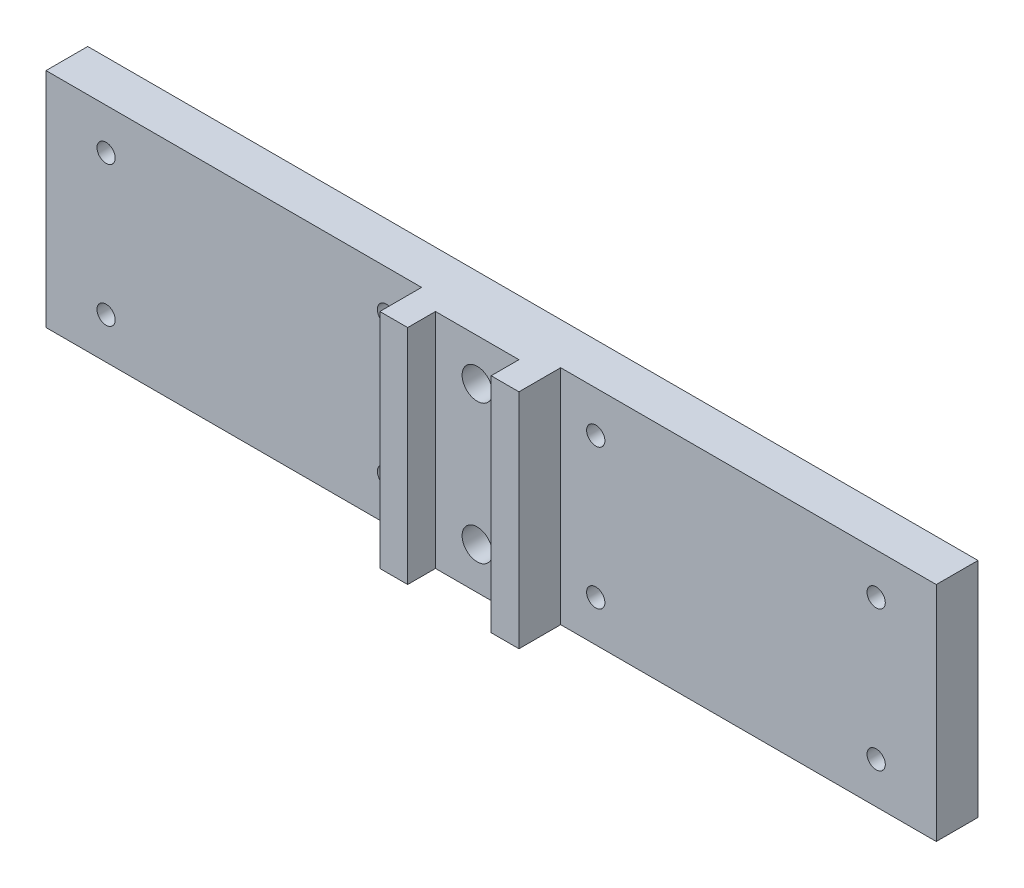
ISO-10303-21;
HEADER;
FILE_DESCRIPTION(('STEP AP214'),'2;1');
FILE_NAME('part.step','',(''),(''),'','','');
FILE_SCHEMA(('AUTOMOTIVE_DESIGN { 1 0 10303 214 1 1 1 1 }'));
ENDSEC;
DATA;
#1=APPLICATION_CONTEXT('core data for automotive mechanical design processes');
#2=APPLICATION_PROTOCOL_DEFINITION('international standard','automotive_design',2000,#1);
#3=PRODUCT_CONTEXT('',#1,'mechanical');
#4=PRODUCT('Part','Part','',(#3));
#5=PRODUCT_RELATED_PRODUCT_CATEGORY('part','',(#4));
#6=PRODUCT_DEFINITION_FORMATION('','',#4);
#7=PRODUCT_DEFINITION_CONTEXT('part definition',#1,'design');
#8=PRODUCT_DEFINITION('design','',#6,#7);
#9=PRODUCT_DEFINITION_SHAPE('','',#8);
#10=(LENGTH_UNIT() NAMED_UNIT(*) SI_UNIT(.MILLI.,.METRE.));
#11=(NAMED_UNIT(*) PLANE_ANGLE_UNIT() SI_UNIT($,.RADIAN.));
#12=(NAMED_UNIT(*) SI_UNIT($,.STERADIAN.) SOLID_ANGLE_UNIT());
#13=UNCERTAINTY_MEASURE_WITH_UNIT(LENGTH_MEASURE(1.E-05),#10,'distance_accuracy_value','');
#14=(GEOMETRIC_REPRESENTATION_CONTEXT(3) GLOBAL_UNCERTAINTY_ASSIGNED_CONTEXT((#13)) GLOBAL_UNIT_ASSIGNED_CONTEXT((#10,
#11,#12)) REPRESENTATION_CONTEXT('',''));
#15=CARTESIAN_POINT('',(0.,0.,0.));
#16=DIRECTION('',(0.,0.,1.));
#17=DIRECTION('',(1.,0.,0.));
#18=AXIS2_PLACEMENT_3D('',#15,#16,#17);
#19=CARTESIAN_POINT('',(0.,0.,9.525));
#20=DIRECTION('',(0.,0.,-1.));
#21=DIRECTION('',(-1.,0.,0.));
#22=AXIS2_PLACEMENT_3D('',#19,#20,#21);
#23=PLANE('',#22);
#24=DIRECTION('',(1.,0.,0.));
#25=VECTOR('',#24,1.);
#26=CARTESIAN_POINT('',(0.,0.,9.525));
#27=LINE('',#26,#25);
#28=CARTESIAN_POINT('',(42.8625,0.,9.525));
#29=VERTEX_POINT('',#28);
#30=CARTESIAN_POINT('',(46.0375,0.,9.52499999999999));
#31=VERTEX_POINT('',#30);
#32=EDGE_CURVE('E162',#29,#31,#27,.T.);
#33=ORIENTED_EDGE('',*,*,#32,.T.);
#34=DIRECTION('',(0.,1.,0.));
#35=VECTOR('',#34,1.);
#36=CARTESIAN_POINT('',(46.0375,0.,9.52499999999999));
#37=LINE('',#36,#35);
#38=CARTESIAN_POINT('',(46.0375,25.4,9.52499999999999));
#39=VERTEX_POINT('',#38);
#40=EDGE_CURVE('E184',#31,#39,#37,.T.);
#41=ORIENTED_EDGE('',*,*,#40,.T.);
#42=DIRECTION('',(-1.,0.,0.));
#43=VECTOR('',#42,1.);
#44=CARTESIAN_POINT('',(0.,25.4,9.525));
#45=LINE('',#44,#43);
#46=CARTESIAN_POINT('',(42.8625,25.4,9.525));
#47=VERTEX_POINT('',#46);
#48=EDGE_CURVE('E161',#39,#47,#45,.T.);
#49=ORIENTED_EDGE('',*,*,#48,.T.);
#50=DIRECTION('',(0.,1.,0.));
#51=VECTOR('',#50,1.);
#52=CARTESIAN_POINT('',(42.8625,0.,9.525));
#53=LINE('',#52,#51);
#54=EDGE_CURVE('E165',#29,#47,#53,.T.);
#55=ORIENTED_EDGE('',*,*,#54,.F.);
#56=EDGE_LOOP('',(#33,#41,#49,#55));
#57=FACE_BOUND('',#56,.T.);
#58=ADVANCED_FACE('F32',(#57),#23,.F.);
#59=CARTESIAN_POINT('',(0.,0.,9.525));
#60=DIRECTION('',(1.,0.,0.));
#61=DIRECTION('',(0.,0.,-1.));
#62=AXIS2_PLACEMENT_3D('',#59,#60,#61);
#63=PLANE('',#62);
#64=DIRECTION('',(0.,0.,-1.));
#65=VECTOR('',#64,1.);
#66=CARTESIAN_POINT('',(0.,0.,9.525));
#67=LINE('',#66,#65);
#68=CARTESIAN_POINT('',(0.,0.,4.76250000000001));
#69=VERTEX_POINT('',#68);
#70=CARTESIAN_POINT('',(0.,0.,0.));
#71=VERTEX_POINT('',#70);
#72=EDGE_CURVE('E11',#69,#71,#67,.T.);
#73=ORIENTED_EDGE('',*,*,#72,.F.);
#74=DIRECTION('',(0.,1.,0.));
#75=VECTOR('',#74,1.);
#76=CARTESIAN_POINT('',(0.,0.,4.76250000000001));
#77=LINE('',#76,#75);
#78=CARTESIAN_POINT('',(0.,25.4,4.76250000000001));
#79=VERTEX_POINT('',#78);
#80=EDGE_CURVE('E159',#69,#79,#77,.T.);
#81=ORIENTED_EDGE('',*,*,#80,.T.);
#82=DIRECTION('',(0.,0.,-1.));
#83=VECTOR('',#82,1.);
#84=CARTESIAN_POINT('',(0.,25.4,9.525));
#85=LINE('',#84,#83);
#86=CARTESIAN_POINT('',(0.,25.4,0.));
#87=VERTEX_POINT('',#86);
#88=EDGE_CURVE('E144',#79,#87,#85,.T.);
#89=ORIENTED_EDGE('',*,*,#88,.T.);
#90=DIRECTION('',(0.,-1.,0.));
#91=VECTOR('',#90,1.);
#92=CARTESIAN_POINT('',(0.,0.,0.));
#93=LINE('',#92,#91);
#94=EDGE_CURVE('E156',#87,#71,#93,.T.);
#95=ORIENTED_EDGE('',*,*,#94,.T.);
#96=EDGE_LOOP('',(#73,#81,#89,#95));
#97=FACE_BOUND('',#96,.T.);
#98=ADVANCED_FACE('F34',(#97),#63,.F.);
#99=CARTESIAN_POINT('',(0.,0.,9.525));
#100=DIRECTION('',(0.,1.,0.));
#101=DIRECTION('',(0.,0.,1.));
#102=AXIS2_PLACEMENT_3D('',#99,#100,#101);
#103=PLANE('',#102);
#104=DIRECTION('',(-1.,0.,0.));
#105=VECTOR('',#104,1.);
#106=CARTESIAN_POINT('',(101.6,0.,4.7625));
#107=LINE('',#106,#105);
#108=CARTESIAN_POINT('',(101.6,0.,4.7625));
#109=VERTEX_POINT('',#108);
#110=CARTESIAN_POINT('',(58.7375,0.,4.76250000000001));
#111=VERTEX_POINT('',#110);
#112=EDGE_CURVE('E120',#109,#111,#107,.T.);
#113=ORIENTED_EDGE('',*,*,#112,.T.);
#114=DIRECTION('',(0.,0.,1.));
#115=VECTOR('',#114,1.);
#116=CARTESIAN_POINT('',(58.7375,0.,9.525));
#117=LINE('',#116,#115);
#118=CARTESIAN_POINT('',(58.7375,0.,9.525));
#119=VERTEX_POINT('',#118);
#120=EDGE_CURVE('E131',#111,#119,#117,.T.);
#121=ORIENTED_EDGE('',*,*,#120,.T.);
#122=CARTESIAN_POINT('',(55.5625,0.,9.525));
#123=VERTEX_POINT('',#122);
#124=EDGE_CURVE('E152',#123,#119,#27,.T.);
#125=ORIENTED_EDGE('',*,*,#124,.F.);
#126=DIRECTION('',(0.,0.,-1.));
#127=VECTOR('',#126,1.);
#128=CARTESIAN_POINT('',(55.5625,0.,9.52499999999999));
#129=LINE('',#128,#127);
#130=CARTESIAN_POINT('',(55.5625,0.,6.35000000000001));
#131=VERTEX_POINT('',#130);
#132=EDGE_CURVE('E55',#123,#131,#129,.T.);
#133=ORIENTED_EDGE('',*,*,#132,.T.);
#134=DIRECTION('',(-1.,0.,0.));
#135=VECTOR('',#134,1.);
#136=CARTESIAN_POINT('',(55.5625,0.,6.35000000000001));
#137=LINE('',#136,#135);
#138=CARTESIAN_POINT('',(46.0375,0.,6.35000000000001));
#139=VERTEX_POINT('',#138);
#140=EDGE_CURVE('E188',#131,#139,#137,.T.);
#141=ORIENTED_EDGE('',*,*,#140,.T.);
#142=DIRECTION('',(0.,0.,1.));
#143=VECTOR('',#142,1.);
#144=CARTESIAN_POINT('',(46.0375,0.,9.52499999999999));
#145=LINE('',#144,#143);
#146=EDGE_CURVE('E196',#139,#31,#145,.T.);
#147=ORIENTED_EDGE('',*,*,#146,.T.);
#148=ORIENTED_EDGE('',*,*,#32,.F.);
#149=DIRECTION('',(0.,0.,-1.));
#150=VECTOR('',#149,1.);
#151=CARTESIAN_POINT('',(42.8625,0.,9.525));
#152=LINE('',#151,#150);
#153=CARTESIAN_POINT('',(42.8625,0.,4.76250000000001));
#154=VERTEX_POINT('',#153);
#155=EDGE_CURVE('E175',#29,#154,#152,.T.);
#156=ORIENTED_EDGE('',*,*,#155,.T.);
#157=DIRECTION('',(-1.,0.,0.));
#158=VECTOR('',#157,1.);
#159=CARTESIAN_POINT('',(0.,0.,4.76250000000001));
#160=LINE('',#159,#158);
#161=EDGE_CURVE('E169',#154,#69,#160,.T.);
#162=ORIENTED_EDGE('',*,*,#161,.T.);
#163=ORIENTED_EDGE('',*,*,#72,.T.);
#164=DIRECTION('',(1.,0.,0.));
#165=VECTOR('',#164,1.);
#166=CARTESIAN_POINT('',(0.,0.,0.));
#167=LINE('',#166,#165);
#168=CARTESIAN_POINT('',(101.6,0.,0.));
#169=VERTEX_POINT('',#168);
#170=EDGE_CURVE('E142',#71,#169,#167,.T.);
#171=ORIENTED_EDGE('',*,*,#170,.T.);
#172=DIRECTION('',(0.,0.,-1.));
#173=VECTOR('',#172,1.);
#174=CARTESIAN_POINT('',(101.6,0.,9.525));
#175=LINE('',#174,#173);
#176=EDGE_CURVE('E40',#109,#169,#175,.T.);
#177=ORIENTED_EDGE('',*,*,#176,.F.);
#178=EDGE_LOOP('',(#113,#121,#125,#133,#141,#147,#148,#156,#162,#163,#171,#177));
#179=FACE_BOUND('',#178,.T.);
#180=ADVANCED_FACE('F140',(#179),#103,.F.);
#181=CARTESIAN_POINT('',(101.6,0.,9.525));
#182=DIRECTION('',(-1.,0.,0.));
#183=DIRECTION('',(0.,0.,1.));
#184=AXIS2_PLACEMENT_3D('',#181,#182,#183);
#185=PLANE('',#184);
#186=DIRECTION('',(0.,0.,-1.));
#187=VECTOR('',#186,1.);
#188=CARTESIAN_POINT('',(101.6,25.4,9.525));
#189=LINE('',#188,#187);
#190=CARTESIAN_POINT('',(101.6,25.4,4.7625));
#191=VERTEX_POINT('',#190);
#192=CARTESIAN_POINT('',(101.6,25.4,0.));
#193=VERTEX_POINT('',#192);
#194=EDGE_CURVE('E138',#191,#193,#189,.T.);
#195=ORIENTED_EDGE('',*,*,#194,.F.);
#196=DIRECTION('',(0.,1.,0.));
#197=VECTOR('',#196,1.);
#198=CARTESIAN_POINT('',(101.6,0.,4.7625));
#199=LINE('',#198,#197);
#200=EDGE_CURVE('E124',#109,#191,#199,.T.);
#201=ORIENTED_EDGE('',*,*,#200,.F.);
#202=ORIENTED_EDGE('',*,*,#176,.T.);
#203=DIRECTION('',(0.,1.,0.));
#204=VECTOR('',#203,1.);
#205=CARTESIAN_POINT('',(101.6,0.,0.));
#206=LINE('',#205,#204);
#207=EDGE_CURVE('E153',#169,#193,#206,.T.);
#208=ORIENTED_EDGE('',*,*,#207,.T.);
#209=EDGE_LOOP('',(#195,#201,#202,#208));
#210=FACE_BOUND('',#209,.T.);
#211=ADVANCED_FACE('F135',(#210),#185,.F.);
#212=CARTESIAN_POINT('',(0.,25.4,9.525));
#213=DIRECTION('',(0.,-1.,0.));
#214=DIRECTION('',(0.,0.,-1.));
#215=AXIS2_PLACEMENT_3D('',#212,#213,#214);
#216=PLANE('',#215);
#217=CARTESIAN_POINT('',(58.7375,25.4,9.525));
#218=VERTEX_POINT('',#217);
#219=CARTESIAN_POINT('',(55.5625,25.4,9.52499999999999));
#220=VERTEX_POINT('',#219);
#221=EDGE_CURVE('E148',#218,#220,#45,.T.);
#222=ORIENTED_EDGE('',*,*,#221,.F.);
#223=DIRECTION('',(0.,0.,1.));
#224=VECTOR('',#223,1.);
#225=CARTESIAN_POINT('',(58.7375,25.4,9.525));
#226=LINE('',#225,#224);
#227=CARTESIAN_POINT('',(58.7375,25.4,4.76250000000001));
#228=VERTEX_POINT('',#227);
#229=EDGE_CURVE('E47',#228,#218,#226,.T.);
#230=ORIENTED_EDGE('',*,*,#229,.F.);
#231=DIRECTION('',(-1.,0.,0.));
#232=VECTOR('',#231,1.);
#233=CARTESIAN_POINT('',(101.6,25.4,4.7625));
#234=LINE('',#233,#232);
#235=EDGE_CURVE('E211',#191,#228,#234,.T.);
#236=ORIENTED_EDGE('',*,*,#235,.F.);
#237=ORIENTED_EDGE('',*,*,#194,.T.);
#238=DIRECTION('',(-1.,0.,0.));
#239=VECTOR('',#238,1.);
#240=CARTESIAN_POINT('',(0.,25.4,0.));
#241=LINE('',#240,#239);
#242=EDGE_CURVE('E149',#193,#87,#241,.T.);
#243=ORIENTED_EDGE('',*,*,#242,.T.);
#244=ORIENTED_EDGE('',*,*,#88,.F.);
#245=DIRECTION('',(-1.,0.,0.));
#246=VECTOR('',#245,1.);
#247=CARTESIAN_POINT('',(0.,25.4,4.76250000000001));
#248=LINE('',#247,#246);
#249=CARTESIAN_POINT('',(42.8625,25.4,4.76250000000001));
#250=VERTEX_POINT('',#249);
#251=EDGE_CURVE('E173',#250,#79,#248,.T.);
#252=ORIENTED_EDGE('',*,*,#251,.F.);
#253=DIRECTION('',(0.,0.,-1.));
#254=VECTOR('',#253,1.);
#255=CARTESIAN_POINT('',(42.8625,25.4,9.525));
#256=LINE('',#255,#254);
#257=EDGE_CURVE('E176',#47,#250,#256,.T.);
#258=ORIENTED_EDGE('',*,*,#257,.F.);
#259=ORIENTED_EDGE('',*,*,#48,.F.);
#260=DIRECTION('',(0.,0.,1.));
#261=VECTOR('',#260,1.);
#262=CARTESIAN_POINT('',(46.0375,25.4,9.52499999999999));
#263=LINE('',#262,#261);
#264=CARTESIAN_POINT('',(46.0375,25.4,6.35000000000001));
#265=VERTEX_POINT('',#264);
#266=EDGE_CURVE('E200',#265,#39,#263,.T.);
#267=ORIENTED_EDGE('',*,*,#266,.F.);
#268=DIRECTION('',(-1.,0.,0.));
#269=VECTOR('',#268,1.);
#270=CARTESIAN_POINT('',(55.5625,25.4,6.35000000000001));
#271=LINE('',#270,#269);
#272=CARTESIAN_POINT('',(55.5625,25.4,6.35000000000001));
#273=VERTEX_POINT('',#272);
#274=EDGE_CURVE('E193',#273,#265,#271,.T.);
#275=ORIENTED_EDGE('',*,*,#274,.F.);
#276=DIRECTION('',(0.,0.,-1.));
#277=VECTOR('',#276,1.);
#278=CARTESIAN_POINT('',(55.5625,25.4,9.52499999999999));
#279=LINE('',#278,#277);
#280=EDGE_CURVE('E197',#220,#273,#279,.T.);
#281=ORIENTED_EDGE('',*,*,#280,.F.);
#282=EDGE_LOOP('',(#222,#230,#236,#237,#243,#244,#252,#258,#259,#267,#275,#281));
#283=FACE_BOUND('',#282,.T.);
#284=ADVANCED_FACE('F310',(#283),#216,.F.);
#285=ORIENTED_EDGE('',*,*,#124,.T.);
#286=DIRECTION('',(0.,1.,0.));
#287=VECTOR('',#286,1.);
#288=CARTESIAN_POINT('',(58.7375,0.,9.525));
#289=LINE('',#288,#287);
#290=EDGE_CURVE('E202',#119,#218,#289,.T.);
#291=ORIENTED_EDGE('',*,*,#290,.T.);
#292=ORIENTED_EDGE('',*,*,#221,.T.);
#293=DIRECTION('',(0.,1.,0.));
#294=VECTOR('',#293,1.);
#295=CARTESIAN_POINT('',(55.5625,0.,9.52499999999999));
#296=LINE('',#295,#294);
#297=EDGE_CURVE('E187',#123,#220,#296,.T.);
#298=ORIENTED_EDGE('',*,*,#297,.F.);
#299=EDGE_LOOP('',(#285,#291,#292,#298));
#300=FACE_BOUND('',#299,.T.);
#301=ADVANCED_FACE('F282',(#300),#23,.F.);
#302=CARTESIAN_POINT('',(0.,0.,0.));
#303=DIRECTION('',(0.,0.,-1.));
#304=DIRECTION('',(-1.,0.,0.));
#305=AXIS2_PLACEMENT_3D('',#302,#303,#304);
#306=PLANE('',#305);
#307=CARTESIAN_POINT('',(38.86,20.7,0.));
#308=DIRECTION('',(0.,0.,-1.));
#309=DIRECTION('',(-1.,0.,0.));
#310=AXIS2_PLACEMENT_3D('',#307,#308,#309);
#311=CIRCLE('',#310,1.0414);
#312=CARTESIAN_POINT('',(37.8186,20.7,0.));
#313=VERTEX_POINT('',#312);
#314=EDGE_CURVE('E271',#313,#313,#311,.T.);
#315=ORIENTED_EDGE('',*,*,#314,.F.);
#316=EDGE_LOOP('',(#315));
#317=FACE_BOUND('',#316,.T.);
#318=CARTESIAN_POINT('',(6.86,20.7,0.));
#319=DIRECTION('',(0.,0.,-1.));
#320=DIRECTION('',(-1.,0.,0.));
#321=AXIS2_PLACEMENT_3D('',#318,#319,#320);
#322=CIRCLE('',#321,1.0414);
#323=CARTESIAN_POINT('',(5.8186,20.7,0.));
#324=VERTEX_POINT('',#323);
#325=EDGE_CURVE('E265',#324,#324,#322,.T.);
#326=ORIENTED_EDGE('',*,*,#325,.F.);
#327=EDGE_LOOP('',(#326));
#328=FACE_BOUND('',#327,.T.);
#329=CARTESIAN_POINT('',(38.86,4.69999999999999,0.));
#330=DIRECTION('',(0.,0.,-1.));
#331=DIRECTION('',(-1.,0.,0.));
#332=AXIS2_PLACEMENT_3D('',#329,#330,#331);
#333=CIRCLE('',#332,1.0414);
#334=CARTESIAN_POINT('',(37.8186,4.69999999999999,0.));
#335=VERTEX_POINT('',#334);
#336=EDGE_CURVE('E259',#335,#335,#333,.T.);
#337=ORIENTED_EDGE('',*,*,#336,.F.);
#338=EDGE_LOOP('',(#337));
#339=FACE_BOUND('',#338,.T.);
#340=CARTESIAN_POINT('',(6.86,4.7,0.));
#341=DIRECTION('',(0.,0.,-1.));
#342=DIRECTION('',(-1.,0.,0.));
#343=AXIS2_PLACEMENT_3D('',#340,#341,#342);
#344=CIRCLE('',#343,1.0414);
#345=CARTESIAN_POINT('',(5.8186,4.7,0.));
#346=VERTEX_POINT('',#345);
#347=EDGE_CURVE('E253',#346,#346,#344,.T.);
#348=ORIENTED_EDGE('',*,*,#347,.F.);
#349=EDGE_LOOP('',(#348));
#350=FACE_BOUND('',#349,.T.);
#351=CARTESIAN_POINT('',(62.74,4.69999999999999,0.));
#352=DIRECTION('',(0.,0.,-1.));
#353=DIRECTION('',(-1.,0.,0.));
#354=AXIS2_PLACEMENT_3D('',#351,#352,#353);
#355=CIRCLE('',#354,1.0414);
#356=CARTESIAN_POINT('',(61.6986,4.69999999999999,0.));
#357=VERTEX_POINT('',#356);
#358=EDGE_CURVE('E247',#357,#357,#355,.T.);
#359=ORIENTED_EDGE('',*,*,#358,.F.);
#360=EDGE_LOOP('',(#359));
#361=FACE_BOUND('',#360,.T.);
#362=CARTESIAN_POINT('',(94.74,4.69999999999999,0.));
#363=DIRECTION('',(0.,0.,-1.));
#364=DIRECTION('',(-1.,0.,0.));
#365=AXIS2_PLACEMENT_3D('',#362,#363,#364);
#366=CIRCLE('',#365,1.0414);
#367=CARTESIAN_POINT('',(93.6986,4.69999999999999,0.));
#368=VERTEX_POINT('',#367);
#369=EDGE_CURVE('E241',#368,#368,#366,.T.);
#370=ORIENTED_EDGE('',*,*,#369,.F.);
#371=EDGE_LOOP('',(#370));
#372=FACE_BOUND('',#371,.T.);
#373=CARTESIAN_POINT('',(62.74,20.7,0.));
#374=DIRECTION('',(0.,0.,-1.));
#375=DIRECTION('',(-1.,0.,0.));
#376=AXIS2_PLACEMENT_3D('',#373,#374,#375);
#377=CIRCLE('',#376,1.0414);
#378=CARTESIAN_POINT('',(61.6986,20.7,0.));
#379=VERTEX_POINT('',#378);
#380=EDGE_CURVE('E235',#379,#379,#377,.T.);
#381=ORIENTED_EDGE('',*,*,#380,.F.);
#382=EDGE_LOOP('',(#381));
#383=FACE_BOUND('',#382,.T.);
#384=CARTESIAN_POINT('',(94.74,20.7,0.));
#385=DIRECTION('',(0.,0.,-1.));
#386=DIRECTION('',(-1.,0.,0.));
#387=AXIS2_PLACEMENT_3D('',#384,#385,#386);
#388=CIRCLE('',#387,1.0414);
#389=CARTESIAN_POINT('',(93.6986,20.7,0.));
#390=VERTEX_POINT('',#389);
#391=EDGE_CURVE('E229',#390,#390,#388,.T.);
#392=ORIENTED_EDGE('',*,*,#391,.F.);
#393=EDGE_LOOP('',(#392));
#394=FACE_BOUND('',#393,.T.);
#395=CARTESIAN_POINT('',(50.8,4.7625,0.));
#396=DIRECTION('',(0.,0.,1.));
#397=DIRECTION('',(1.,0.,0.));
#398=AXIS2_PLACEMENT_3D('',#395,#396,#397);
#399=CIRCLE('',#398,1.7272);
#400=CARTESIAN_POINT('',(52.5272,4.7625,0.));
#401=VERTEX_POINT('',#400);
#402=EDGE_CURVE('E220',#401,#401,#399,.T.);
#403=ORIENTED_EDGE('',*,*,#402,.T.);
#404=EDGE_LOOP('',(#403));
#405=FACE_BOUND('',#404,.T.);
#406=CARTESIAN_POINT('',(50.8,20.6375,0.));
#407=DIRECTION('',(0.,0.,1.));
#408=DIRECTION('',(1.,0.,0.));
#409=AXIS2_PLACEMENT_3D('',#406,#407,#408);
#410=CIRCLE('',#409,1.7272);
#411=CARTESIAN_POINT('',(52.5272,20.6375,0.));
#412=VERTEX_POINT('',#411);
#413=EDGE_CURVE('E213',#412,#412,#410,.T.);
#414=ORIENTED_EDGE('',*,*,#413,.T.);
#415=EDGE_LOOP('',(#414));
#416=FACE_BOUND('',#415,.T.);
#417=ORIENTED_EDGE('',*,*,#94,.F.);
#418=ORIENTED_EDGE('',*,*,#242,.F.);
#419=ORIENTED_EDGE('',*,*,#207,.F.);
#420=ORIENTED_EDGE('',*,*,#170,.F.);
#421=EDGE_LOOP('',(#417,#418,#419,#420));
#422=FACE_BOUND('',#421,.T.);
#423=ADVANCED_FACE('F278',(#317,#328,#339,#350,#361,#372,#383,#394,#405,#416,#422),#306,.T.);
#424=CARTESIAN_POINT('',(0.,0.,4.76250000000001));
#425=DIRECTION('',(0.,0.,-1.));
#426=DIRECTION('',(-1.,0.,0.));
#427=AXIS2_PLACEMENT_3D('',#424,#425,#426);
#428=PLANE('',#427);
#429=CARTESIAN_POINT('',(38.86,20.7,4.76250000000001));
#430=DIRECTION('',(0.,0.,-1.));
#431=DIRECTION('',(-1.,0.,0.));
#432=AXIS2_PLACEMENT_3D('',#429,#430,#431);
#433=CIRCLE('',#432,1.0414);
#434=CARTESIAN_POINT('',(37.8186,20.7,4.76250000000001));
#435=VERTEX_POINT('',#434);
#436=EDGE_CURVE('E268',#435,#435,#433,.T.);
#437=ORIENTED_EDGE('',*,*,#436,.T.);
#438=EDGE_LOOP('',(#437));
#439=FACE_BOUND('',#438,.T.);
#440=CARTESIAN_POINT('',(6.86,20.7,4.76250000000001));
#441=DIRECTION('',(0.,0.,-1.));
#442=DIRECTION('',(-1.,0.,0.));
#443=AXIS2_PLACEMENT_3D('',#440,#441,#442);
#444=CIRCLE('',#443,1.0414);
#445=CARTESIAN_POINT('',(5.8186,20.7,4.76250000000001));
#446=VERTEX_POINT('',#445);
#447=EDGE_CURVE('E262',#446,#446,#444,.T.);
#448=ORIENTED_EDGE('',*,*,#447,.T.);
#449=EDGE_LOOP('',(#448));
#450=FACE_BOUND('',#449,.T.);
#451=CARTESIAN_POINT('',(38.86,4.69999999999999,4.76250000000001));
#452=DIRECTION('',(0.,0.,-1.));
#453=DIRECTION('',(-1.,0.,0.));
#454=AXIS2_PLACEMENT_3D('',#451,#452,#453);
#455=CIRCLE('',#454,1.0414);
#456=CARTESIAN_POINT('',(37.8186,4.69999999999999,4.76250000000001));
#457=VERTEX_POINT('',#456);
#458=EDGE_CURVE('E256',#457,#457,#455,.T.);
#459=ORIENTED_EDGE('',*,*,#458,.T.);
#460=EDGE_LOOP('',(#459));
#461=FACE_BOUND('',#460,.T.);
#462=CARTESIAN_POINT('',(6.86,4.7,4.76250000000001));
#463=DIRECTION('',(0.,0.,-1.));
#464=DIRECTION('',(-1.,0.,0.));
#465=AXIS2_PLACEMENT_3D('',#462,#463,#464);
#466=CIRCLE('',#465,1.0414);
#467=CARTESIAN_POINT('',(5.8186,4.7,4.76250000000001));
#468=VERTEX_POINT('',#467);
#469=EDGE_CURVE('E250',#468,#468,#466,.T.);
#470=ORIENTED_EDGE('',*,*,#469,.T.);
#471=EDGE_LOOP('',(#470));
#472=FACE_BOUND('',#471,.T.);
#473=ORIENTED_EDGE('',*,*,#251,.T.);
#474=ORIENTED_EDGE('',*,*,#80,.F.);
#475=ORIENTED_EDGE('',*,*,#161,.F.);
#476=DIRECTION('',(0.,1.,0.));
#477=VECTOR('',#476,1.);
#478=CARTESIAN_POINT('',(42.8625,0.,4.76250000000001));
#479=LINE('',#478,#477);
#480=EDGE_CURVE('E168',#154,#250,#479,.T.);
#481=ORIENTED_EDGE('',*,*,#480,.T.);
#482=EDGE_LOOP('',(#473,#474,#475,#481));
#483=FACE_BOUND('',#482,.T.);
#484=ADVANCED_FACE('F281',(#439,#450,#461,#472,#483),#428,.F.);
#485=CARTESIAN_POINT('',(42.8625,0.,9.525));
#486=DIRECTION('',(1.,0.,0.));
#487=DIRECTION('',(0.,0.,-1.));
#488=AXIS2_PLACEMENT_3D('',#485,#486,#487);
#489=PLANE('',#488);
#490=ORIENTED_EDGE('',*,*,#257,.T.);
#491=ORIENTED_EDGE('',*,*,#480,.F.);
#492=ORIENTED_EDGE('',*,*,#155,.F.);
#493=ORIENTED_EDGE('',*,*,#54,.T.);
#494=EDGE_LOOP('',(#490,#491,#492,#493));
#495=FACE_BOUND('',#494,.T.);
#496=ADVANCED_FACE('F374',(#495),#489,.F.);
#497=CARTESIAN_POINT('',(46.0375,0.,9.52499999999999));
#498=DIRECTION('',(-1.,0.,0.));
#499=DIRECTION('',(0.,0.,1.));
#500=AXIS2_PLACEMENT_3D('',#497,#498,#499);
#501=PLANE('',#500);
#502=ORIENTED_EDGE('',*,*,#266,.T.);
#503=ORIENTED_EDGE('',*,*,#40,.F.);
#504=ORIENTED_EDGE('',*,*,#146,.F.);
#505=DIRECTION('',(0.,1.,0.));
#506=VECTOR('',#505,1.);
#507=CARTESIAN_POINT('',(46.0375,0.,6.35000000000001));
#508=LINE('',#507,#506);
#509=EDGE_CURVE('E179',#139,#265,#508,.T.);
#510=ORIENTED_EDGE('',*,*,#509,.T.);
#511=EDGE_LOOP('',(#502,#503,#504,#510));
#512=FACE_BOUND('',#511,.T.);
#513=ADVANCED_FACE('F379',(#512),#501,.F.);
#514=CARTESIAN_POINT('',(55.5625,0.,6.35000000000001));
#515=DIRECTION('',(0.,0.,-1.));
#516=DIRECTION('',(-1.,0.,0.));
#517=AXIS2_PLACEMENT_3D('',#514,#515,#516);
#518=PLANE('',#517);
#519=CARTESIAN_POINT('',(50.8,4.7625,6.35000000000001));
#520=DIRECTION('',(0.,0.,1.));
#521=DIRECTION('',(1.,0.,0.));
#522=AXIS2_PLACEMENT_3D('',#519,#520,#521);
#523=CIRCLE('',#522,1.72719999999998);
#524=CARTESIAN_POINT('',(52.5272,4.7625,6.35000000000001));
#525=VERTEX_POINT('',#524);
#526=EDGE_CURVE('E223',#525,#525,#523,.T.);
#527=ORIENTED_EDGE('',*,*,#526,.F.);
#528=EDGE_LOOP('',(#527));
#529=FACE_BOUND('',#528,.T.);
#530=CARTESIAN_POINT('',(50.8,20.6375,6.35000000000001));
#531=DIRECTION('',(0.,0.,1.));
#532=DIRECTION('',(1.,0.,0.));
#533=AXIS2_PLACEMENT_3D('',#530,#531,#532);
#534=CIRCLE('',#533,1.72719999999998);
#535=CARTESIAN_POINT('',(52.5272,20.6375,6.35000000000001));
#536=VERTEX_POINT('',#535);
#537=EDGE_CURVE('E217',#536,#536,#534,.T.);
#538=ORIENTED_EDGE('',*,*,#537,.F.);
#539=EDGE_LOOP('',(#538));
#540=FACE_BOUND('',#539,.T.);
#541=ORIENTED_EDGE('',*,*,#274,.T.);
#542=ORIENTED_EDGE('',*,*,#509,.F.);
#543=ORIENTED_EDGE('',*,*,#140,.F.);
#544=DIRECTION('',(0.,1.,0.));
#545=VECTOR('',#544,1.);
#546=CARTESIAN_POINT('',(55.5625,0.,6.35000000000001));
#547=LINE('',#546,#545);
#548=EDGE_CURVE('E190',#131,#273,#547,.T.);
#549=ORIENTED_EDGE('',*,*,#548,.T.);
#550=EDGE_LOOP('',(#541,#542,#543,#549));
#551=FACE_BOUND('',#550,.T.);
#552=ADVANCED_FACE('F321',(#529,#540,#551),#518,.F.);
#553=CARTESIAN_POINT('',(55.5625,0.,9.52499999999999));
#554=DIRECTION('',(1.,0.,0.));
#555=DIRECTION('',(0.,0.,-1.));
#556=AXIS2_PLACEMENT_3D('',#553,#554,#555);
#557=PLANE('',#556);
#558=ORIENTED_EDGE('',*,*,#280,.T.);
#559=ORIENTED_EDGE('',*,*,#548,.F.);
#560=ORIENTED_EDGE('',*,*,#132,.F.);
#561=ORIENTED_EDGE('',*,*,#297,.T.);
#562=EDGE_LOOP('',(#558,#559,#560,#561));
#563=FACE_BOUND('',#562,.T.);
#564=ADVANCED_FACE('F316',(#563),#557,.F.);
#565=CARTESIAN_POINT('',(58.7375,0.,9.525));
#566=DIRECTION('',(-1.,0.,0.));
#567=DIRECTION('',(0.,0.,1.));
#568=AXIS2_PLACEMENT_3D('',#565,#566,#567);
#569=PLANE('',#568);
#570=ORIENTED_EDGE('',*,*,#229,.T.);
#571=ORIENTED_EDGE('',*,*,#290,.F.);
#572=ORIENTED_EDGE('',*,*,#120,.F.);
#573=DIRECTION('',(0.,1.,0.));
#574=VECTOR('',#573,1.);
#575=CARTESIAN_POINT('',(58.7375,0.,4.76250000000001));
#576=LINE('',#575,#574);
#577=EDGE_CURVE('E126',#111,#228,#576,.T.);
#578=ORIENTED_EDGE('',*,*,#577,.T.);
#579=EDGE_LOOP('',(#570,#571,#572,#578));
#580=FACE_BOUND('',#579,.T.);
#581=ADVANCED_FACE('F323',(#580),#569,.F.);
#582=CARTESIAN_POINT('',(101.6,0.,4.7625));
#583=DIRECTION('',(0.,0.,-1.));
#584=DIRECTION('',(-1.,0.,0.));
#585=AXIS2_PLACEMENT_3D('',#582,#583,#584);
#586=PLANE('',#585);
#587=CARTESIAN_POINT('',(62.74,4.69999999999999,4.76250000000001));
#588=DIRECTION('',(0.,0.,-1.));
#589=DIRECTION('',(-1.,0.,0.));
#590=AXIS2_PLACEMENT_3D('',#587,#588,#589);
#591=CIRCLE('',#590,1.0414);
#592=CARTESIAN_POINT('',(61.6986,4.69999999999999,4.76250000000001));
#593=VERTEX_POINT('',#592);
#594=EDGE_CURVE('E244',#593,#593,#591,.T.);
#595=ORIENTED_EDGE('',*,*,#594,.T.);
#596=EDGE_LOOP('',(#595));
#597=FACE_BOUND('',#596,.T.);
#598=CARTESIAN_POINT('',(94.74,4.69999999999999,4.7625));
#599=DIRECTION('',(0.,0.,-1.));
#600=DIRECTION('',(-1.,0.,0.));
#601=AXIS2_PLACEMENT_3D('',#598,#599,#600);
#602=CIRCLE('',#601,1.0414);
#603=CARTESIAN_POINT('',(93.6986,4.69999999999999,4.7625));
#604=VERTEX_POINT('',#603);
#605=EDGE_CURVE('E238',#604,#604,#602,.T.);
#606=ORIENTED_EDGE('',*,*,#605,.T.);
#607=EDGE_LOOP('',(#606));
#608=FACE_BOUND('',#607,.T.);
#609=CARTESIAN_POINT('',(62.74,20.7,4.76250000000001));
#610=DIRECTION('',(0.,0.,-1.));
#611=DIRECTION('',(-1.,0.,0.));
#612=AXIS2_PLACEMENT_3D('',#609,#610,#611);
#613=CIRCLE('',#612,1.0414);
#614=CARTESIAN_POINT('',(61.6986,20.7,4.76250000000001));
#615=VERTEX_POINT('',#614);
#616=EDGE_CURVE('E232',#615,#615,#613,.T.);
#617=ORIENTED_EDGE('',*,*,#616,.T.);
#618=EDGE_LOOP('',(#617));
#619=FACE_BOUND('',#618,.T.);
#620=CARTESIAN_POINT('',(94.74,20.7,4.7625));
#621=DIRECTION('',(0.,0.,-1.));
#622=DIRECTION('',(-1.,0.,0.));
#623=AXIS2_PLACEMENT_3D('',#620,#621,#622);
#624=CIRCLE('',#623,1.0414);
#625=CARTESIAN_POINT('',(93.6986,20.7,4.7625));
#626=VERTEX_POINT('',#625);
#627=EDGE_CURVE('E226',#626,#626,#624,.T.);
#628=ORIENTED_EDGE('',*,*,#627,.T.);
#629=EDGE_LOOP('',(#628));
#630=FACE_BOUND('',#629,.T.);
#631=ORIENTED_EDGE('',*,*,#235,.T.);
#632=ORIENTED_EDGE('',*,*,#577,.F.);
#633=ORIENTED_EDGE('',*,*,#112,.F.);
#634=ORIENTED_EDGE('',*,*,#200,.T.);
#635=EDGE_LOOP('',(#631,#632,#633,#634));
#636=FACE_BOUND('',#635,.T.);
#637=ADVANCED_FACE('F123',(#597,#608,#619,#630,#636),#586,.F.);
#638=CARTESIAN_POINT('',(50.8,20.6375,6.35000000000001));
#639=DIRECTION('',(0.,0.,1.));
#640=DIRECTION('',(1.,0.,0.));
#641=AXIS2_PLACEMENT_3D('',#638,#639,#640);
#642=CYLINDRICAL_SURFACE('',#641,1.72719999999999);
#643=ORIENTED_EDGE('',*,*,#413,.F.);
#644=EDGE_LOOP('',(#643));
#645=FACE_BOUND('',#644,.T.);
#646=ORIENTED_EDGE('',*,*,#537,.T.);
#647=EDGE_LOOP('',(#646));
#648=FACE_BOUND('',#647,.T.);
#649=ADVANCED_FACE('F330',(#645,#648),#642,.F.);
#650=CARTESIAN_POINT('',(50.8,4.7625,6.35000000000001));
#651=DIRECTION('',(0.,0.,1.));
#652=DIRECTION('',(1.,0.,0.));
#653=AXIS2_PLACEMENT_3D('',#650,#651,#652);
#654=CYLINDRICAL_SURFACE('',#653,1.72719999999999);
#655=ORIENTED_EDGE('',*,*,#402,.F.);
#656=EDGE_LOOP('',(#655));
#657=FACE_BOUND('',#656,.T.);
#658=ORIENTED_EDGE('',*,*,#526,.T.);
#659=EDGE_LOOP('',(#658));
#660=FACE_BOUND('',#659,.T.);
#661=ADVANCED_FACE('F419',(#657,#660),#654,.F.);
#662=CARTESIAN_POINT('',(94.74,20.7,0.));
#663=DIRECTION('',(0.,0.,-1.));
#664=DIRECTION('',(-1.,0.,0.));
#665=AXIS2_PLACEMENT_3D('',#662,#663,#664);
#666=CYLINDRICAL_SURFACE('',#665,1.0414);
#667=ORIENTED_EDGE('',*,*,#391,.T.);
#668=EDGE_LOOP('',(#667));
#669=FACE_BOUND('',#668,.T.);
#670=ORIENTED_EDGE('',*,*,#627,.F.);
#671=EDGE_LOOP('',(#670));
#672=FACE_BOUND('',#671,.T.);
#673=ADVANCED_FACE('F428',(#669,#672),#666,.F.);
#674=CARTESIAN_POINT('',(62.74,20.7,0.));
#675=DIRECTION('',(0.,0.,-1.));
#676=DIRECTION('',(-1.,0.,0.));
#677=AXIS2_PLACEMENT_3D('',#674,#675,#676);
#678=CYLINDRICAL_SURFACE('',#677,1.0414);
#679=ORIENTED_EDGE('',*,*,#380,.T.);
#680=EDGE_LOOP('',(#679));
#681=FACE_BOUND('',#680,.T.);
#682=ORIENTED_EDGE('',*,*,#616,.F.);
#683=EDGE_LOOP('',(#682));
#684=FACE_BOUND('',#683,.T.);
#685=ADVANCED_FACE('F456',(#681,#684),#678,.F.);
#686=CARTESIAN_POINT('',(94.74,4.69999999999999,0.));
#687=DIRECTION('',(0.,0.,-1.));
#688=DIRECTION('',(-1.,0.,0.));
#689=AXIS2_PLACEMENT_3D('',#686,#687,#688);
#690=CYLINDRICAL_SURFACE('',#689,1.0414);
#691=ORIENTED_EDGE('',*,*,#369,.T.);
#692=EDGE_LOOP('',(#691));
#693=FACE_BOUND('',#692,.T.);
#694=ORIENTED_EDGE('',*,*,#605,.F.);
#695=EDGE_LOOP('',(#694));
#696=FACE_BOUND('',#695,.T.);
#697=ADVANCED_FACE('F466',(#693,#696),#690,.F.);
#698=CARTESIAN_POINT('',(62.74,4.69999999999999,0.));
#699=DIRECTION('',(0.,0.,-1.));
#700=DIRECTION('',(-1.,0.,0.));
#701=AXIS2_PLACEMENT_3D('',#698,#699,#700);
#702=CYLINDRICAL_SURFACE('',#701,1.0414);
#703=ORIENTED_EDGE('',*,*,#358,.T.);
#704=EDGE_LOOP('',(#703));
#705=FACE_BOUND('',#704,.T.);
#706=ORIENTED_EDGE('',*,*,#594,.F.);
#707=EDGE_LOOP('',(#706));
#708=FACE_BOUND('',#707,.T.);
#709=ADVANCED_FACE('F476',(#705,#708),#702,.F.);
#710=CARTESIAN_POINT('',(6.86,4.7,0.));
#711=DIRECTION('',(0.,0.,-1.));
#712=DIRECTION('',(-1.,0.,0.));
#713=AXIS2_PLACEMENT_3D('',#710,#711,#712);
#714=CYLINDRICAL_SURFACE('',#713,1.0414);
#715=ORIENTED_EDGE('',*,*,#347,.T.);
#716=EDGE_LOOP('',(#715));
#717=FACE_BOUND('',#716,.T.);
#718=ORIENTED_EDGE('',*,*,#469,.F.);
#719=EDGE_LOOP('',(#718));
#720=FACE_BOUND('',#719,.T.);
#721=ADVANCED_FACE('F486',(#717,#720),#714,.F.);
#722=CARTESIAN_POINT('',(38.86,4.69999999999999,0.));
#723=DIRECTION('',(0.,0.,-1.));
#724=DIRECTION('',(-1.,0.,0.));
#725=AXIS2_PLACEMENT_3D('',#722,#723,#724);
#726=CYLINDRICAL_SURFACE('',#725,1.0414);
#727=ORIENTED_EDGE('',*,*,#336,.T.);
#728=EDGE_LOOP('',(#727));
#729=FACE_BOUND('',#728,.T.);
#730=ORIENTED_EDGE('',*,*,#458,.F.);
#731=EDGE_LOOP('',(#730));
#732=FACE_BOUND('',#731,.T.);
#733=ADVANCED_FACE('F496',(#729,#732),#726,.F.);
#734=CARTESIAN_POINT('',(6.86,20.7,0.));
#735=DIRECTION('',(0.,0.,-1.));
#736=DIRECTION('',(-1.,0.,0.));
#737=AXIS2_PLACEMENT_3D('',#734,#735,#736);
#738=CYLINDRICAL_SURFACE('',#737,1.0414);
#739=ORIENTED_EDGE('',*,*,#325,.T.);
#740=EDGE_LOOP('',(#739));
#741=FACE_BOUND('',#740,.T.);
#742=ORIENTED_EDGE('',*,*,#447,.F.);
#743=EDGE_LOOP('',(#742));
#744=FACE_BOUND('',#743,.T.);
#745=ADVANCED_FACE('F506',(#741,#744),#738,.F.);
#746=CARTESIAN_POINT('',(38.86,20.7,0.));
#747=DIRECTION('',(0.,0.,-1.));
#748=DIRECTION('',(-1.,0.,0.));
#749=AXIS2_PLACEMENT_3D('',#746,#747,#748);
#750=CYLINDRICAL_SURFACE('',#749,1.0414);
#751=ORIENTED_EDGE('',*,*,#314,.T.);
#752=EDGE_LOOP('',(#751));
#753=FACE_BOUND('',#752,.T.);
#754=ORIENTED_EDGE('',*,*,#436,.F.);
#755=EDGE_LOOP('',(#754));
#756=FACE_BOUND('',#755,.T.);
#757=ADVANCED_FACE('F275',(#753,#756),#750,.F.);
#758=CLOSED_SHELL('',(#58,#98,#180,#211,#284,#301,#423,#484,#496,#513,#552,#564,#581,#637,#649,
#661,#673,#685,#697,#709,#721,#733,#745,#757));
#759=MANIFOLD_SOLID_BREP('B2',#758);
#760=ADVANCED_BREP_SHAPE_REPRESENTATION('',(#18,#759),#14);
#761=SHAPE_DEFINITION_REPRESENTATION(#9,#760);
ENDSEC;
END-ISO-10303-21;
